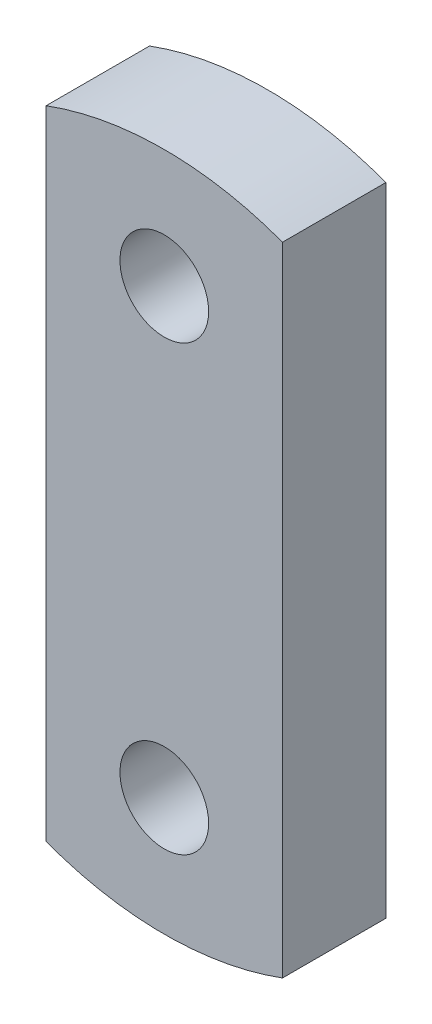
ISO-10303-21;
HEADER;
FILE_DESCRIPTION(('STEP AP214'),'2;1');
FILE_NAME('part.step','',(''),(''),'','','');
FILE_SCHEMA(('AUTOMOTIVE_DESIGN { 1 0 10303 214 1 1 1 1 }'));
ENDSEC;
DATA;
#1=APPLICATION_CONTEXT('core data for automotive mechanical design processes');
#2=APPLICATION_PROTOCOL_DEFINITION('international standard','automotive_design',2000,#1);
#3=PRODUCT_CONTEXT('',#1,'mechanical');
#4=PRODUCT('Part','Part','',(#3));
#5=PRODUCT_RELATED_PRODUCT_CATEGORY('part','',(#4));
#6=PRODUCT_DEFINITION_FORMATION('','',#4);
#7=PRODUCT_DEFINITION_CONTEXT('part definition',#1,'design');
#8=PRODUCT_DEFINITION('design','',#6,#7);
#9=PRODUCT_DEFINITION_SHAPE('','',#8);
#10=(LENGTH_UNIT() NAMED_UNIT(*) SI_UNIT(.MILLI.,.METRE.));
#11=(NAMED_UNIT(*) PLANE_ANGLE_UNIT() SI_UNIT($,.RADIAN.));
#12=(NAMED_UNIT(*) SI_UNIT($,.STERADIAN.) SOLID_ANGLE_UNIT());
#13=UNCERTAINTY_MEASURE_WITH_UNIT(LENGTH_MEASURE(1.E-05),#10,'distance_accuracy_value','');
#14=(GEOMETRIC_REPRESENTATION_CONTEXT(3) GLOBAL_UNCERTAINTY_ASSIGNED_CONTEXT((#13)) GLOBAL_UNIT_ASSIGNED_CONTEXT((#10,
#11,#12)) REPRESENTATION_CONTEXT('',''));
#15=CARTESIAN_POINT('',(0.,0.,0.));
#16=DIRECTION('',(0.,0.,1.));
#17=DIRECTION('',(1.,0.,0.));
#18=AXIS2_PLACEMENT_3D('',#15,#16,#17);
#19=CARTESIAN_POINT('',(0.,0.,35.));
#20=DIRECTION('',(0.,0.,1.));
#21=DIRECTION('',(1.,0.,0.));
#22=AXIS2_PLACEMENT_3D('',#19,#20,#21);
#23=PLANE('',#22);
#24=CARTESIAN_POINT('',(0.,-75.,35.));
#25=DIRECTION('',(0.,0.,1.));
#26=DIRECTION('',(1.,0.,0.));
#27=AXIS2_PLACEMENT_3D('',#24,#25,#26);
#28=CIRCLE('',#27,15.);
#29=CARTESIAN_POINT('',(15.,-75.,35.));
#30=VERTEX_POINT('',#29);
#31=EDGE_CURVE('E104',#30,#30,#28,.T.);
#32=ORIENTED_EDGE('',*,*,#31,.F.);
#33=EDGE_LOOP('',(#32));
#34=FACE_BOUND('',#33,.T.);
#35=CARTESIAN_POINT('',(0.,0.,35.));
#36=DIRECTION('',(0.,0.,1.));
#37=DIRECTION('',(1.,0.,0.));
#38=AXIS2_PLACEMENT_3D('',#35,#36,#37);
#39=CIRCLE('',#38,115.);
#40=CARTESIAN_POINT('',(-40.,-107.819293264239,35.));
#41=VERTEX_POINT('',#40);
#42=CARTESIAN_POINT('',(40.,-107.819293264239,35.));
#43=VERTEX_POINT('',#42);
#44=EDGE_CURVE('E89',#41,#43,#39,.T.);
#45=ORIENTED_EDGE('',*,*,#44,.T.);
#46=DIRECTION('',(0.,1.,0.));
#47=VECTOR('',#46,1.);
#48=CARTESIAN_POINT('',(40.,107.819293264239,35.));
#49=LINE('',#48,#47);
#50=CARTESIAN_POINT('',(40.,107.819293264239,35.));
#51=VERTEX_POINT('',#50);
#52=EDGE_CURVE('E84',#43,#51,#49,.T.);
#53=ORIENTED_EDGE('',*,*,#52,.T.);
#54=CARTESIAN_POINT('',(0.,0.,35.));
#55=DIRECTION('',(0.,0.,1.));
#56=DIRECTION('',(1.,0.,0.));
#57=AXIS2_PLACEMENT_3D('',#54,#55,#56);
#58=CIRCLE('',#57,115.);
#59=CARTESIAN_POINT('',(-40.,107.819293264239,35.));
#60=VERTEX_POINT('',#59);
#61=EDGE_CURVE('E87',#51,#60,#58,.T.);
#62=ORIENTED_EDGE('',*,*,#61,.T.);
#63=DIRECTION('',(0.,-1.,0.));
#64=VECTOR('',#63,1.);
#65=CARTESIAN_POINT('',(-40.,107.819293264239,35.));
#66=LINE('',#65,#64);
#67=EDGE_CURVE('E54',#60,#41,#66,.T.);
#68=ORIENTED_EDGE('',*,*,#67,.T.);
#69=EDGE_LOOP('',(#45,#53,#62,#68));
#70=FACE_BOUND('',#69,.T.);
#71=CARTESIAN_POINT('',(0.,75.,35.));
#72=DIRECTION('',(0.,0.,1.));
#73=DIRECTION('',(1.,0.,0.));
#74=AXIS2_PLACEMENT_3D('',#71,#72,#73);
#75=CIRCLE('',#74,15.);
#76=CARTESIAN_POINT('',(15.,75.,35.));
#77=VERTEX_POINT('',#76);
#78=EDGE_CURVE('E119',#77,#77,#75,.T.);
#79=ORIENTED_EDGE('',*,*,#78,.F.);
#80=EDGE_LOOP('',(#79));
#81=FACE_BOUND('',#80,.T.);
#82=ADVANCED_FACE('F37',(#34,#70,#81),#23,.T.);
#83=CARTESIAN_POINT('',(0.,0.,0.));
#84=DIRECTION('',(0.,0.,1.));
#85=DIRECTION('',(1.,0.,0.));
#86=AXIS2_PLACEMENT_3D('',#83,#84,#85);
#87=PLANE('',#86);
#88=CARTESIAN_POINT('',(0.,0.,0.));
#89=DIRECTION('',(0.,0.,1.));
#90=DIRECTION('',(1.,0.,0.));
#91=AXIS2_PLACEMENT_3D('',#88,#89,#90);
#92=CIRCLE('',#91,115.);
#93=CARTESIAN_POINT('',(-40.,-107.819293264239,0.));
#94=VERTEX_POINT('',#93);
#95=CARTESIAN_POINT('',(40.,-107.819293264239,0.));
#96=VERTEX_POINT('',#95);
#97=EDGE_CURVE('E101',#94,#96,#92,.T.);
#98=ORIENTED_EDGE('',*,*,#97,.F.);
#99=DIRECTION('',(0.,-1.,0.));
#100=VECTOR('',#99,1.);
#101=CARTESIAN_POINT('',(-40.,107.819293264239,0.));
#102=LINE('',#101,#100);
#103=CARTESIAN_POINT('',(-40.,107.819293264239,0.));
#104=VERTEX_POINT('',#103);
#105=EDGE_CURVE('E77',#104,#94,#102,.T.);
#106=ORIENTED_EDGE('',*,*,#105,.F.);
#107=CARTESIAN_POINT('',(0.,0.,0.));
#108=DIRECTION('',(0.,0.,1.));
#109=DIRECTION('',(1.,0.,0.));
#110=AXIS2_PLACEMENT_3D('',#107,#108,#109);
#111=CIRCLE('',#110,115.);
#112=CARTESIAN_POINT('',(40.,107.819293264239,0.));
#113=VERTEX_POINT('',#112);
#114=EDGE_CURVE('E71',#113,#104,#111,.T.);
#115=ORIENTED_EDGE('',*,*,#114,.F.);
#116=DIRECTION('',(0.,1.,0.));
#117=VECTOR('',#116,1.);
#118=CARTESIAN_POINT('',(40.,107.819293264239,0.));
#119=LINE('',#118,#117);
#120=EDGE_CURVE('E93',#96,#113,#119,.T.);
#121=ORIENTED_EDGE('',*,*,#120,.F.);
#122=EDGE_LOOP('',(#98,#106,#115,#121));
#123=FACE_BOUND('',#122,.T.);
#124=CARTESIAN_POINT('',(0.,-75.,0.));
#125=DIRECTION('',(0.,0.,1.));
#126=DIRECTION('',(1.,0.,0.));
#127=AXIS2_PLACEMENT_3D('',#124,#125,#126);
#128=CIRCLE('',#127,15.);
#129=CARTESIAN_POINT('',(15.,-75.,0.));
#130=VERTEX_POINT('',#129);
#131=EDGE_CURVE('E116',#130,#130,#128,.T.);
#132=ORIENTED_EDGE('',*,*,#131,.T.);
#133=EDGE_LOOP('',(#132));
#134=FACE_BOUND('',#133,.T.);
#135=CARTESIAN_POINT('',(0.,75.,0.));
#136=DIRECTION('',(0.,0.,1.));
#137=DIRECTION('',(1.,0.,0.));
#138=AXIS2_PLACEMENT_3D('',#135,#136,#137);
#139=CIRCLE('',#138,15.);
#140=CARTESIAN_POINT('',(15.,75.,0.));
#141=VERTEX_POINT('',#140);
#142=EDGE_CURVE('E122',#141,#141,#139,.T.);
#143=ORIENTED_EDGE('',*,*,#142,.T.);
#144=EDGE_LOOP('',(#143));
#145=FACE_BOUND('',#144,.T.);
#146=ADVANCED_FACE('F112',(#123,#134,#145),#87,.F.);
#147=CARTESIAN_POINT('',(0.,0.,35.));
#148=DIRECTION('',(0.,0.,-1.));
#149=DIRECTION('',(-1.,0.,0.));
#150=AXIS2_PLACEMENT_3D('',#147,#148,#149);
#151=CYLINDRICAL_SURFACE('',#150,115.);
#152=ORIENTED_EDGE('',*,*,#97,.T.);
#153=DIRECTION('',(0.,0.,-1.));
#154=VECTOR('',#153,1.);
#155=CARTESIAN_POINT('',(40.,-107.819293264239,35.));
#156=LINE('',#155,#154);
#157=EDGE_CURVE('E11',#43,#96,#156,.T.);
#158=ORIENTED_EDGE('',*,*,#157,.F.);
#159=ORIENTED_EDGE('',*,*,#44,.F.);
#160=DIRECTION('',(0.,0.,-1.));
#161=VECTOR('',#160,1.);
#162=CARTESIAN_POINT('',(-40.,-107.819293264239,35.));
#163=LINE('',#162,#161);
#164=EDGE_CURVE('E97',#41,#94,#163,.T.);
#165=ORIENTED_EDGE('',*,*,#164,.T.);
#166=EDGE_LOOP('',(#152,#158,#159,#165));
#167=FACE_BOUND('',#166,.T.);
#168=ADVANCED_FACE('F39',(#167),#151,.T.);
#169=CARTESIAN_POINT('',(40.,107.819293264239,35.));
#170=DIRECTION('',(-1.,0.,0.));
#171=DIRECTION('',(0.,-1.,0.));
#172=AXIS2_PLACEMENT_3D('',#169,#170,#171);
#173=PLANE('',#172);
#174=ORIENTED_EDGE('',*,*,#120,.T.);
#175=DIRECTION('',(0.,0.,-1.));
#176=VECTOR('',#175,1.);
#177=CARTESIAN_POINT('',(40.,107.819293264239,35.));
#178=LINE('',#177,#176);
#179=EDGE_CURVE('E46',#51,#113,#178,.T.);
#180=ORIENTED_EDGE('',*,*,#179,.F.);
#181=ORIENTED_EDGE('',*,*,#52,.F.);
#182=ORIENTED_EDGE('',*,*,#157,.T.);
#183=EDGE_LOOP('',(#174,#180,#181,#182));
#184=FACE_BOUND('',#183,.T.);
#185=ADVANCED_FACE('F92',(#184),#173,.F.);
#186=CARTESIAN_POINT('',(0.,0.,35.));
#187=DIRECTION('',(0.,0.,-1.));
#188=DIRECTION('',(-1.,0.,0.));
#189=AXIS2_PLACEMENT_3D('',#186,#187,#188);
#190=CYLINDRICAL_SURFACE('',#189,115.);
#191=ORIENTED_EDGE('',*,*,#114,.T.);
#192=DIRECTION('',(0.,0.,-1.));
#193=VECTOR('',#192,1.);
#194=CARTESIAN_POINT('',(-40.,107.819293264239,35.));
#195=LINE('',#194,#193);
#196=EDGE_CURVE('E94',#60,#104,#195,.T.);
#197=ORIENTED_EDGE('',*,*,#196,.F.);
#198=ORIENTED_EDGE('',*,*,#61,.F.);
#199=ORIENTED_EDGE('',*,*,#179,.T.);
#200=EDGE_LOOP('',(#191,#197,#198,#199));
#201=FACE_BOUND('',#200,.T.);
#202=ADVANCED_FACE('F95',(#201),#190,.T.);
#203=CARTESIAN_POINT('',(-40.,107.819293264239,35.));
#204=DIRECTION('',(1.,0.,0.));
#205=DIRECTION('',(0.,1.,0.));
#206=AXIS2_PLACEMENT_3D('',#203,#204,#205);
#207=PLANE('',#206);
#208=ORIENTED_EDGE('',*,*,#105,.T.);
#209=ORIENTED_EDGE('',*,*,#164,.F.);
#210=ORIENTED_EDGE('',*,*,#67,.F.);
#211=ORIENTED_EDGE('',*,*,#196,.T.);
#212=EDGE_LOOP('',(#208,#209,#210,#211));
#213=FACE_BOUND('',#212,.T.);
#214=ADVANCED_FACE('F109',(#213),#207,.F.);
#215=CARTESIAN_POINT('',(0.,-75.,35.));
#216=DIRECTION('',(0.,0.,-1.));
#217=DIRECTION('',(-1.,0.,0.));
#218=AXIS2_PLACEMENT_3D('',#215,#216,#217);
#219=CYLINDRICAL_SURFACE('',#218,15.);
#220=ORIENTED_EDGE('',*,*,#31,.T.);
#221=EDGE_LOOP('',(#220));
#222=FACE_BOUND('',#221,.T.);
#223=ORIENTED_EDGE('',*,*,#131,.F.);
#224=EDGE_LOOP('',(#223));
#225=FACE_BOUND('',#224,.T.);
#226=ADVANCED_FACE('F139',(#222,#225),#219,.F.);
#227=CARTESIAN_POINT('',(0.,75.,35.));
#228=DIRECTION('',(0.,0.,-1.));
#229=DIRECTION('',(-1.,0.,0.));
#230=AXIS2_PLACEMENT_3D('',#227,#228,#229);
#231=CYLINDRICAL_SURFACE('',#230,15.);
#232=ORIENTED_EDGE('',*,*,#78,.T.);
#233=EDGE_LOOP('',(#232));
#234=FACE_BOUND('',#233,.T.);
#235=ORIENTED_EDGE('',*,*,#142,.F.);
#236=EDGE_LOOP('',(#235));
#237=FACE_BOUND('',#236,.T.);
#238=ADVANCED_FACE('F128',(#234,#237),#231,.F.);
#239=CLOSED_SHELL('',(#82,#146,#168,#185,#202,#214,#226,#238));
#240=MANIFOLD_SOLID_BREP('B2',#239);
#241=ADVANCED_BREP_SHAPE_REPRESENTATION('',(#18,#240),#14);
#242=SHAPE_DEFINITION_REPRESENTATION(#9,#241);
ENDSEC;
END-ISO-10303-21;
